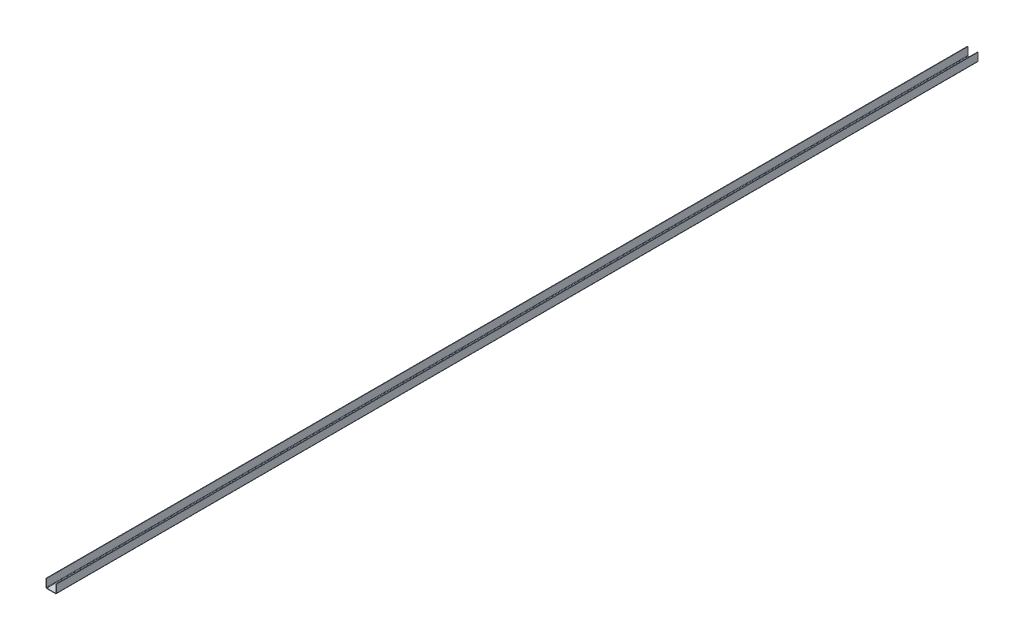
ISO-10303-21;
HEADER;
FILE_DESCRIPTION(('STEP AP214'),'2;1');
FILE_NAME('part.step','',(''),(''),'','','');
FILE_SCHEMA(('AUTOMOTIVE_DESIGN { 1 0 10303 214 1 1 1 1 }'));
ENDSEC;
DATA;
#1=APPLICATION_CONTEXT('core data for automotive mechanical design processes');
#2=APPLICATION_PROTOCOL_DEFINITION('international standard','automotive_design',2000,#1);
#3=PRODUCT_CONTEXT('',#1,'mechanical');
#4=PRODUCT('Part','Part','',(#3));
#5=PRODUCT_RELATED_PRODUCT_CATEGORY('part','',(#4));
#6=PRODUCT_DEFINITION_FORMATION('','',#4);
#7=PRODUCT_DEFINITION_CONTEXT('part definition',#1,'design');
#8=PRODUCT_DEFINITION('design','',#6,#7);
#9=PRODUCT_DEFINITION_SHAPE('','',#8);
#10=(LENGTH_UNIT() NAMED_UNIT(*) SI_UNIT(.MILLI.,.METRE.));
#11=(NAMED_UNIT(*) PLANE_ANGLE_UNIT() SI_UNIT($,.RADIAN.));
#12=(NAMED_UNIT(*) SI_UNIT($,.STERADIAN.) SOLID_ANGLE_UNIT());
#13=UNCERTAINTY_MEASURE_WITH_UNIT(LENGTH_MEASURE(1.E-05),#10,'distance_accuracy_value','');
#14=(GEOMETRIC_REPRESENTATION_CONTEXT(3) GLOBAL_UNCERTAINTY_ASSIGNED_CONTEXT((#13)) GLOBAL_UNIT_ASSIGNED_CONTEXT((#10,
#11,#12)) REPRESENTATION_CONTEXT('',''));
#15=CARTESIAN_POINT('',(0.,0.,0.));
#16=DIRECTION('',(0.,0.,1.));
#17=DIRECTION('',(1.,0.,0.));
#18=AXIS2_PLACEMENT_3D('',#15,#16,#17);
#19=CARTESIAN_POINT('',(-5.73267326732672,-9.84158415841584,498.5));
#20=DIRECTION('',(0.,1.,0.));
#21=DIRECTION('',(-1.,0.,0.));
#22=AXIS2_PLACEMENT_3D('',#19,#20,#21);
#23=CYLINDRICAL_SURFACE('',#22,3.25000000000003);
#24=CARTESIAN_POINT('',(-5.73267326732672,-9.84158415841584,498.5));
#25=DIRECTION('',(0.,1.,0.));
#26=DIRECTION('',(-1.,0.,0.));
#27=AXIS2_PLACEMENT_3D('',#24,#25,#26);
#28=CIRCLE('',#27,3.25000000000003);
#29=CARTESIAN_POINT('',(-8.98267326732676,-9.84158415841584,498.5));
#30=VERTEX_POINT('',#29);
#31=EDGE_CURVE('E42',#30,#30,#28,.T.);
#32=ORIENTED_EDGE('',*,*,#31,.F.);
#33=EDGE_LOOP('',(#32));
#34=FACE_BOUND('',#33,.T.);
#35=CARTESIAN_POINT('',(-5.73267326732672,-8.34158415841584,498.5));
#36=DIRECTION('',(0.,1.,0.));
#37=DIRECTION('',(-1.,0.,0.));
#38=AXIS2_PLACEMENT_3D('',#35,#36,#37);
#39=CIRCLE('',#38,3.25000000000003);
#40=CARTESIAN_POINT('',(-8.98267326732676,-8.34158415841584,498.5));
#41=VERTEX_POINT('',#40);
#42=EDGE_CURVE('E11',#41,#41,#39,.T.);
#43=ORIENTED_EDGE('',*,*,#42,.T.);
#44=EDGE_LOOP('',(#43));
#45=FACE_BOUND('',#44,.T.);
#46=ADVANCED_FACE('F34',(#34,#45),#23,.F.);
#47=CARTESIAN_POINT('',(-21.2326732673267,-6.84158415841582,2997.));
#48=DIRECTION('',(-1.,0.,0.));
#49=DIRECTION('',(0.,0.,1.));
#50=AXIS2_PLACEMENT_3D('',#47,#48,#49);
#51=PLANE('',#50);
#52=DIRECTION('',(0.,1.,0.));
#53=VECTOR('',#52,1.);
#54=CARTESIAN_POINT('',(-21.2326732673267,-6.84158415841582,0.));
#55=LINE('',#54,#53);
#56=CARTESIAN_POINT('',(-21.2326732673267,-6.84158415841584,0.));
#57=VERTEX_POINT('',#56);
#58=CARTESIAN_POINT('',(-21.2326732673267,18.1584158415842,0.));
#59=VERTEX_POINT('',#58);
#60=EDGE_CURVE('E156',#57,#59,#55,.T.);
#61=ORIENTED_EDGE('',*,*,#60,.T.);
#62=DIRECTION('',(0.,0.,-1.));
#63=VECTOR('',#62,1.);
#64=CARTESIAN_POINT('',(-21.2326732673267,18.1584158415842,2997.));
#65=LINE('',#64,#63);
#66=CARTESIAN_POINT('',(-21.2326732673267,18.1584158415842,2997.));
#67=VERTEX_POINT('',#66);
#68=EDGE_CURVE('E203',#67,#59,#65,.T.);
#69=ORIENTED_EDGE('',*,*,#68,.F.);
#70=DIRECTION('',(0.,1.,0.));
#71=VECTOR('',#70,1.);
#72=CARTESIAN_POINT('',(-21.2326732673267,-6.84158415841582,2997.));
#73=LINE('',#72,#71);
#74=CARTESIAN_POINT('',(-21.2326732673267,-6.84158415841584,2997.));
#75=VERTEX_POINT('',#74);
#76=EDGE_CURVE('E103',#75,#67,#73,.T.);
#77=ORIENTED_EDGE('',*,*,#76,.F.);
#78=DIRECTION('',(0.,0.,-1.));
#79=VECTOR('',#78,1.);
#80=CARTESIAN_POINT('',(-21.2326732673267,-6.84158415841584,2997.));
#81=LINE('',#80,#79);
#82=EDGE_CURVE('E152',#75,#57,#81,.T.);
#83=ORIENTED_EDGE('',*,*,#82,.T.);
#84=EDGE_LOOP('',(#61,#69,#77,#83));
#85=FACE_BOUND('',#84,.T.);
#86=ADVANCED_FACE('F211',(#85),#51,.F.);
#87=CARTESIAN_POINT('',(-22.7326732673267,18.1584158415842,2997.));
#88=DIRECTION('',(0.,1.,0.));
#89=DIRECTION('',(0.,0.,1.));
#90=AXIS2_PLACEMENT_3D('',#87,#88,#89);
#91=PLANE('',#90);
#92=DIRECTION('',(1.,0.,0.));
#93=VECTOR('',#92,1.);
#94=CARTESIAN_POINT('',(-22.7326732673267,18.1584158415842,0.));
#95=LINE('',#94,#93);
#96=CARTESIAN_POINT('',(-22.7326732673267,18.1584158415842,0.));
#97=VERTEX_POINT('',#96);
#98=EDGE_CURVE('E159',#97,#59,#95,.T.);
#99=ORIENTED_EDGE('',*,*,#98,.F.);
#100=DIRECTION('',(0.,0.,-1.));
#101=VECTOR('',#100,1.);
#102=CARTESIAN_POINT('',(-22.7326732673267,18.1584158415842,2997.));
#103=LINE('',#102,#101);
#104=CARTESIAN_POINT('',(-22.7326732673267,18.1584158415842,2997.));
#105=VERTEX_POINT('',#104);
#106=EDGE_CURVE('E201',#105,#97,#103,.T.);
#107=ORIENTED_EDGE('',*,*,#106,.F.);
#108=DIRECTION('',(1.,0.,0.));
#109=VECTOR('',#108,1.);
#110=CARTESIAN_POINT('',(-22.7326732673267,18.1584158415842,2997.));
#111=LINE('',#110,#109);
#112=EDGE_CURVE('E267',#105,#67,#111,.T.);
#113=ORIENTED_EDGE('',*,*,#112,.T.);
#114=ORIENTED_EDGE('',*,*,#68,.T.);
#115=EDGE_LOOP('',(#99,#107,#113,#114));
#116=FACE_BOUND('',#115,.T.);
#117=ADVANCED_FACE('F253',(#116),#91,.T.);
#118=CARTESIAN_POINT('',(-22.7326732673267,-6.84158415841582,2997.));
#119=DIRECTION('',(-1.,0.,0.));
#120=DIRECTION('',(0.,0.,1.));
#121=AXIS2_PLACEMENT_3D('',#118,#119,#120);
#122=PLANE('',#121);
#123=DIRECTION('',(0.,1.,0.));
#124=VECTOR('',#123,1.);
#125=CARTESIAN_POINT('',(-22.7326732673267,-6.84158415841582,0.));
#126=LINE('',#125,#124);
#127=CARTESIAN_POINT('',(-22.7326732673267,-6.84158415841584,0.));
#128=VERTEX_POINT('',#127);
#129=EDGE_CURVE('E163',#128,#97,#126,.T.);
#130=ORIENTED_EDGE('',*,*,#129,.F.);
#131=DIRECTION('',(0.,0.,-1.));
#132=VECTOR('',#131,1.);
#133=CARTESIAN_POINT('',(-22.7326732673267,-6.84158415841584,2997.));
#134=LINE('',#133,#132);
#135=CARTESIAN_POINT('',(-22.7326732673267,-6.84158415841584,2997.));
#136=VERTEX_POINT('',#135);
#137=EDGE_CURVE('E199',#136,#128,#134,.T.);
#138=ORIENTED_EDGE('',*,*,#137,.F.);
#139=DIRECTION('',(0.,1.,0.));
#140=VECTOR('',#139,1.);
#141=CARTESIAN_POINT('',(-22.7326732673267,-6.84158415841582,2997.));
#142=LINE('',#141,#140);
#143=EDGE_CURVE('E270',#136,#105,#142,.T.);
#144=ORIENTED_EDGE('',*,*,#143,.T.);
#145=ORIENTED_EDGE('',*,*,#106,.T.);
#146=EDGE_LOOP('',(#130,#138,#144,#145));
#147=FACE_BOUND('',#146,.T.);
#148=ADVANCED_FACE('F249',(#147),#122,.T.);
#149=CARTESIAN_POINT('',(-19.7326732673267,-6.84158415841584,2997.));
#150=DIRECTION('',(0.,0.,-1.));
#151=DIRECTION('',(-1.,0.,0.));
#152=AXIS2_PLACEMENT_3D('',#149,#150,#151);
#153=CYLINDRICAL_SURFACE('',#152,3.);
#154=CARTESIAN_POINT('',(-19.7326732673267,-6.84158415841584,0.));
#155=DIRECTION('',(0.,0.,-1.));
#156=DIRECTION('',(-1.,0.,0.));
#157=AXIS2_PLACEMENT_3D('',#154,#155,#156);
#158=CIRCLE('',#157,3.);
#159=CARTESIAN_POINT('',(-19.7326732673267,-9.84158415841584,0.));
#160=VERTEX_POINT('',#159);
#161=EDGE_CURVE('E166',#160,#128,#158,.T.);
#162=ORIENTED_EDGE('',*,*,#161,.F.);
#163=DIRECTION('',(0.,0.,-1.));
#164=VECTOR('',#163,1.);
#165=CARTESIAN_POINT('',(-19.7326732673267,-9.84158415841584,2997.));
#166=LINE('',#165,#164);
#167=CARTESIAN_POINT('',(-19.7326732673267,-9.84158415841584,2997.));
#168=VERTEX_POINT('',#167);
#169=EDGE_CURVE('E197',#168,#160,#166,.T.);
#170=ORIENTED_EDGE('',*,*,#169,.F.);
#171=CARTESIAN_POINT('',(-19.7326732673267,-6.84158415841584,2997.));
#172=DIRECTION('',(0.,0.,-1.));
#173=DIRECTION('',(-1.,0.,0.));
#174=AXIS2_PLACEMENT_3D('',#171,#172,#173);
#175=CIRCLE('',#174,3.);
#176=EDGE_CURVE('E272',#168,#136,#175,.T.);
#177=ORIENTED_EDGE('',*,*,#176,.T.);
#178=ORIENTED_EDGE('',*,*,#137,.T.);
#179=EDGE_LOOP('',(#162,#170,#177,#178));
#180=FACE_BOUND('',#179,.T.);
#181=ADVANCED_FACE('F245',(#180),#153,.T.);
#182=CARTESIAN_POINT('',(8.26732673267326,-9.84158415841584,2997.));
#183=DIRECTION('',(0.,-1.,0.));
#184=DIRECTION('',(1.,0.,0.));
#185=AXIS2_PLACEMENT_3D('',#182,#183,#184);
#186=PLANE('',#185);
#187=CARTESIAN_POINT('',(-5.73267326732672,-9.84158415841584,1498.5));
#188=DIRECTION('',(0.,1.,0.));
#189=DIRECTION('',(-1.,0.,0.));
#190=AXIS2_PLACEMENT_3D('',#187,#188,#189);
#191=CIRCLE('',#190,3.25000000000003);
#192=CARTESIAN_POINT('',(-8.98267326732676,-9.84158415841584,1498.5));
#193=VERTEX_POINT('',#192);
#194=EDGE_CURVE('E309',#193,#193,#191,.T.);
#195=ORIENTED_EDGE('',*,*,#194,.T.);
#196=EDGE_LOOP('',(#195));
#197=FACE_BOUND('',#196,.T.);
#198=CARTESIAN_POINT('',(-5.73267326732672,-9.84158415841584,2498.5));
#199=DIRECTION('',(0.,1.,0.));
#200=DIRECTION('',(-1.,0.,0.));
#201=AXIS2_PLACEMENT_3D('',#198,#199,#200);
#202=CIRCLE('',#201,3.25000000000003);
#203=CARTESIAN_POINT('',(-8.98267326732676,-9.84158415841584,2498.5));
#204=VERTEX_POINT('',#203);
#205=EDGE_CURVE('E160',#204,#204,#202,.T.);
#206=ORIENTED_EDGE('',*,*,#205,.T.);
#207=EDGE_LOOP('',(#206));
#208=FACE_BOUND('',#207,.T.);
#209=DIRECTION('',(-1.,0.,0.));
#210=VECTOR('',#209,1.);
#211=CARTESIAN_POINT('',(8.26732673267326,-9.84158415841584,0.));
#212=LINE('',#211,#210);
#213=CARTESIAN_POINT('',(8.26732673267326,-9.84158415841584,0.));
#214=VERTEX_POINT('',#213);
#215=EDGE_CURVE('E169',#214,#160,#212,.T.);
#216=ORIENTED_EDGE('',*,*,#215,.F.);
#217=DIRECTION('',(0.,0.,-1.));
#218=VECTOR('',#217,1.);
#219=CARTESIAN_POINT('',(8.26732673267326,-9.84158415841584,2997.));
#220=LINE('',#219,#218);
#221=CARTESIAN_POINT('',(8.26732673267326,-9.84158415841584,2997.));
#222=VERTEX_POINT('',#221);
#223=EDGE_CURVE('E195',#222,#214,#220,.T.);
#224=ORIENTED_EDGE('',*,*,#223,.F.);
#225=DIRECTION('',(-1.,0.,0.));
#226=VECTOR('',#225,1.);
#227=CARTESIAN_POINT('',(8.26732673267326,-9.84158415841584,2997.));
#228=LINE('',#227,#226);
#229=EDGE_CURVE('E279',#222,#168,#228,.T.);
#230=ORIENTED_EDGE('',*,*,#229,.T.);
#231=ORIENTED_EDGE('',*,*,#169,.T.);
#232=EDGE_LOOP('',(#216,#224,#230,#231));
#233=FACE_BOUND('',#232,.T.);
#234=ORIENTED_EDGE('',*,*,#31,.T.);
#235=EDGE_LOOP('',(#234));
#236=FACE_BOUND('',#235,.T.);
#237=ADVANCED_FACE('F207',(#197,#208,#233,#236),#186,.T.);
#238=CARTESIAN_POINT('',(8.26732673267328,-6.84158415841584,2997.));
#239=DIRECTION('',(0.,0.,-1.));
#240=DIRECTION('',(-1.,0.,0.));
#241=AXIS2_PLACEMENT_3D('',#238,#239,#240);
#242=CYLINDRICAL_SURFACE('',#241,3.);
#243=CARTESIAN_POINT('',(8.26732673267328,-6.84158415841584,0.));
#244=DIRECTION('',(0.,0.,-1.));
#245=DIRECTION('',(-1.,0.,0.));
#246=AXIS2_PLACEMENT_3D('',#243,#244,#245);
#247=CIRCLE('',#246,3.);
#248=CARTESIAN_POINT('',(11.2673267326733,-6.84158415841582,0.));
#249=VERTEX_POINT('',#248);
#250=EDGE_CURVE('E172',#249,#214,#247,.T.);
#251=ORIENTED_EDGE('',*,*,#250,.F.);
#252=DIRECTION('',(0.,0.,-1.));
#253=VECTOR('',#252,1.);
#254=CARTESIAN_POINT('',(11.2673267326733,-6.84158415841582,2997.));
#255=LINE('',#254,#253);
#256=CARTESIAN_POINT('',(11.2673267326733,-6.84158415841582,2997.));
#257=VERTEX_POINT('',#256);
#258=EDGE_CURVE('E193',#257,#249,#255,.T.);
#259=ORIENTED_EDGE('',*,*,#258,.F.);
#260=CARTESIAN_POINT('',(8.26732673267328,-6.84158415841584,2997.));
#261=DIRECTION('',(0.,0.,-1.));
#262=DIRECTION('',(-1.,0.,0.));
#263=AXIS2_PLACEMENT_3D('',#260,#261,#262);
#264=CIRCLE('',#263,3.);
#265=EDGE_CURVE('E282',#257,#222,#264,.T.);
#266=ORIENTED_EDGE('',*,*,#265,.T.);
#267=ORIENTED_EDGE('',*,*,#223,.T.);
#268=EDGE_LOOP('',(#251,#259,#266,#267));
#269=FACE_BOUND('',#268,.T.);
#270=ADVANCED_FACE('F238',(#269),#242,.T.);
#271=CARTESIAN_POINT('',(11.2673267326733,18.1584158415842,2997.));
#272=DIRECTION('',(1.,0.,0.));
#273=DIRECTION('',(0.,1.,0.));
#274=AXIS2_PLACEMENT_3D('',#271,#272,#273);
#275=PLANE('',#274);
#276=DIRECTION('',(0.,-1.,0.));
#277=VECTOR('',#276,1.);
#278=CARTESIAN_POINT('',(11.2673267326733,18.1584158415842,0.));
#279=LINE('',#278,#277);
#280=CARTESIAN_POINT('',(11.2673267326733,18.1584158415842,0.));
#281=VERTEX_POINT('',#280);
#282=EDGE_CURVE('E175',#281,#249,#279,.T.);
#283=ORIENTED_EDGE('',*,*,#282,.F.);
#284=DIRECTION('',(0.,0.,-1.));
#285=VECTOR('',#284,1.);
#286=CARTESIAN_POINT('',(11.2673267326733,18.1584158415842,2997.));
#287=LINE('',#286,#285);
#288=CARTESIAN_POINT('',(11.2673267326733,18.1584158415842,2997.));
#289=VERTEX_POINT('',#288);
#290=EDGE_CURVE('E191',#289,#281,#287,.T.);
#291=ORIENTED_EDGE('',*,*,#290,.F.);
#292=DIRECTION('',(0.,-1.,0.));
#293=VECTOR('',#292,1.);
#294=CARTESIAN_POINT('',(11.2673267326733,18.1584158415842,2997.));
#295=LINE('',#294,#293);
#296=EDGE_CURVE('E285',#289,#257,#295,.T.);
#297=ORIENTED_EDGE('',*,*,#296,.T.);
#298=ORIENTED_EDGE('',*,*,#258,.T.);
#299=EDGE_LOOP('',(#283,#291,#297,#298));
#300=FACE_BOUND('',#299,.T.);
#301=ADVANCED_FACE('F234',(#300),#275,.T.);
#302=CARTESIAN_POINT('',(9.76732673267327,18.1584158415842,2997.));
#303=DIRECTION('',(0.,1.,0.));
#304=DIRECTION('',(0.,0.,1.));
#305=AXIS2_PLACEMENT_3D('',#302,#303,#304);
#306=PLANE('',#305);
#307=DIRECTION('',(1.,0.,0.));
#308=VECTOR('',#307,1.);
#309=CARTESIAN_POINT('',(9.76732673267327,18.1584158415842,0.));
#310=LINE('',#309,#308);
#311=CARTESIAN_POINT('',(9.76732673267327,18.1584158415842,0.));
#312=VERTEX_POINT('',#311);
#313=EDGE_CURVE('E178',#312,#281,#310,.T.);
#314=ORIENTED_EDGE('',*,*,#313,.F.);
#315=DIRECTION('',(0.,0.,-1.));
#316=VECTOR('',#315,1.);
#317=CARTESIAN_POINT('',(9.76732673267327,18.1584158415842,2997.));
#318=LINE('',#317,#316);
#319=CARTESIAN_POINT('',(9.76732673267327,18.1584158415842,2997.));
#320=VERTEX_POINT('',#319);
#321=EDGE_CURVE('E189',#320,#312,#318,.T.);
#322=ORIENTED_EDGE('',*,*,#321,.F.);
#323=DIRECTION('',(1.,0.,0.));
#324=VECTOR('',#323,1.);
#325=CARTESIAN_POINT('',(9.76732673267327,18.1584158415842,2997.));
#326=LINE('',#325,#324);
#327=EDGE_CURVE('E288',#320,#289,#326,.T.);
#328=ORIENTED_EDGE('',*,*,#327,.T.);
#329=ORIENTED_EDGE('',*,*,#290,.T.);
#330=EDGE_LOOP('',(#314,#322,#328,#329));
#331=FACE_BOUND('',#330,.T.);
#332=ADVANCED_FACE('F230',(#331),#306,.T.);
#333=CARTESIAN_POINT('',(9.76732673267327,18.1584158415842,2997.));
#334=DIRECTION('',(1.,0.,0.));
#335=DIRECTION('',(0.,1.,0.));
#336=AXIS2_PLACEMENT_3D('',#333,#334,#335);
#337=PLANE('',#336);
#338=DIRECTION('',(0.,-1.,0.));
#339=VECTOR('',#338,1.);
#340=CARTESIAN_POINT('',(9.76732673267327,18.1584158415842,0.));
#341=LINE('',#340,#339);
#342=CARTESIAN_POINT('',(9.76732673267328,-6.84158415841583,0.));
#343=VERTEX_POINT('',#342);
#344=EDGE_CURVE('E181',#312,#343,#341,.T.);
#345=ORIENTED_EDGE('',*,*,#344,.T.);
#346=DIRECTION('',(0.,0.,-1.));
#347=VECTOR('',#346,1.);
#348=CARTESIAN_POINT('',(9.76732673267328,-6.84158415841583,2997.));
#349=LINE('',#348,#347);
#350=CARTESIAN_POINT('',(9.76732673267328,-6.84158415841583,2997.));
#351=VERTEX_POINT('',#350);
#352=EDGE_CURVE('E146',#351,#343,#349,.T.);
#353=ORIENTED_EDGE('',*,*,#352,.F.);
#354=DIRECTION('',(0.,-1.,0.));
#355=VECTOR('',#354,1.);
#356=CARTESIAN_POINT('',(9.76732673267327,18.1584158415842,2997.));
#357=LINE('',#356,#355);
#358=EDGE_CURVE('E137',#320,#351,#357,.T.);
#359=ORIENTED_EDGE('',*,*,#358,.F.);
#360=ORIENTED_EDGE('',*,*,#321,.T.);
#361=EDGE_LOOP('',(#345,#353,#359,#360));
#362=FACE_BOUND('',#361,.T.);
#363=ADVANCED_FACE('F222',(#362),#337,.F.);
#364=CARTESIAN_POINT('',(8.26732673267328,-6.84158415841584,2997.));
#365=DIRECTION('',(0.,0.,-1.));
#366=DIRECTION('',(-1.,0.,0.));
#367=AXIS2_PLACEMENT_3D('',#364,#365,#366);
#368=CYLINDRICAL_SURFACE('',#367,1.5);
#369=CARTESIAN_POINT('',(8.26732673267328,-6.84158415841584,0.));
#370=DIRECTION('',(0.,0.,1.));
#371=DIRECTION('',(1.,0.,0.));
#372=AXIS2_PLACEMENT_3D('',#369,#370,#371);
#373=CIRCLE('',#372,1.5);
#374=CARTESIAN_POINT('',(8.26732673267326,-8.34158415841584,0.));
#375=VERTEX_POINT('',#374);
#376=EDGE_CURVE('E145',#343,#375,#373,.F.);
#377=ORIENTED_EDGE('',*,*,#376,.T.);
#378=DIRECTION('',(0.,0.,-1.));
#379=VECTOR('',#378,1.);
#380=CARTESIAN_POINT('',(8.26732673267326,-8.34158415841584,2997.));
#381=LINE('',#380,#379);
#382=CARTESIAN_POINT('',(8.26732673267326,-8.34158415841584,2997.));
#383=VERTEX_POINT('',#382);
#384=EDGE_CURVE('E142',#383,#375,#381,.T.);
#385=ORIENTED_EDGE('',*,*,#384,.F.);
#386=CARTESIAN_POINT('',(8.26732673267328,-6.84158415841584,2997.));
#387=DIRECTION('',(0.,0.,1.));
#388=DIRECTION('',(1.,0.,0.));
#389=AXIS2_PLACEMENT_3D('',#386,#387,#388);
#390=CIRCLE('',#389,1.5);
#391=EDGE_CURVE('E130',#351,#383,#390,.F.);
#392=ORIENTED_EDGE('',*,*,#391,.F.);
#393=ORIENTED_EDGE('',*,*,#352,.T.);
#394=EDGE_LOOP('',(#377,#385,#392,#393));
#395=FACE_BOUND('',#394,.T.);
#396=ADVANCED_FACE('F143',(#395),#368,.F.);
#397=CARTESIAN_POINT('',(8.26732673267326,-8.34158415841584,2997.));
#398=DIRECTION('',(0.,-1.,0.));
#399=DIRECTION('',(1.,0.,0.));
#400=AXIS2_PLACEMENT_3D('',#397,#398,#399);
#401=PLANE('',#400);
#402=CARTESIAN_POINT('',(-5.73267326732672,-8.34158415841584,1498.5));
#403=DIRECTION('',(0.,1.,0.));
#404=DIRECTION('',(-1.,0.,0.));
#405=AXIS2_PLACEMENT_3D('',#402,#403,#404);
#406=CIRCLE('',#405,3.25000000000003);
#407=CARTESIAN_POINT('',(-8.98267326732676,-8.34158415841584,1498.5));
#408=VERTEX_POINT('',#407);
#409=EDGE_CURVE('E304',#408,#408,#406,.T.);
#410=ORIENTED_EDGE('',*,*,#409,.F.);
#411=EDGE_LOOP('',(#410));
#412=FACE_BOUND('',#411,.T.);
#413=CARTESIAN_POINT('',(-5.73267326732672,-8.34158415841584,2498.5));
#414=DIRECTION('',(0.,1.,0.));
#415=DIRECTION('',(-1.,0.,0.));
#416=AXIS2_PLACEMENT_3D('',#413,#414,#415);
#417=CIRCLE('',#416,3.25000000000003);
#418=CARTESIAN_POINT('',(-8.98267326732676,-8.34158415841584,2498.5));
#419=VERTEX_POINT('',#418);
#420=EDGE_CURVE('E301',#419,#419,#417,.T.);
#421=ORIENTED_EDGE('',*,*,#420,.F.);
#422=EDGE_LOOP('',(#421));
#423=FACE_BOUND('',#422,.T.);
#424=DIRECTION('',(-1.,0.,0.));
#425=VECTOR('',#424,1.);
#426=CARTESIAN_POINT('',(8.26732673267326,-8.34158415841584,0.));
#427=LINE('',#426,#425);
#428=CARTESIAN_POINT('',(-19.7326732673267,-8.34158415841584,0.));
#429=VERTEX_POINT('',#428);
#430=EDGE_CURVE('E91',#375,#429,#427,.T.);
#431=ORIENTED_EDGE('',*,*,#430,.T.);
#432=DIRECTION('',(0.,0.,-1.));
#433=VECTOR('',#432,1.);
#434=CARTESIAN_POINT('',(-19.7326732673267,-8.34158415841584,2997.));
#435=LINE('',#434,#433);
#436=CARTESIAN_POINT('',(-19.7326732673267,-8.34158415841584,2997.));
#437=VERTEX_POINT('',#436);
#438=EDGE_CURVE('E147',#437,#429,#435,.T.);
#439=ORIENTED_EDGE('',*,*,#438,.F.);
#440=DIRECTION('',(-1.,0.,0.));
#441=VECTOR('',#440,1.);
#442=CARTESIAN_POINT('',(8.26732673267326,-8.34158415841584,2997.));
#443=LINE('',#442,#441);
#444=EDGE_CURVE('E134',#383,#437,#443,.T.);
#445=ORIENTED_EDGE('',*,*,#444,.F.);
#446=ORIENTED_EDGE('',*,*,#384,.T.);
#447=EDGE_LOOP('',(#431,#439,#445,#446));
#448=FACE_BOUND('',#447,.T.);
#449=ORIENTED_EDGE('',*,*,#42,.F.);
#450=EDGE_LOOP('',(#449));
#451=FACE_BOUND('',#450,.T.);
#452=ADVANCED_FACE('F149',(#412,#423,#448,#451),#401,.F.);
#453=CARTESIAN_POINT('',(-19.7326732673267,-6.84158415841584,2997.));
#454=DIRECTION('',(0.,0.,-1.));
#455=DIRECTION('',(-1.,0.,0.));
#456=AXIS2_PLACEMENT_3D('',#453,#454,#455);
#457=CYLINDRICAL_SURFACE('',#456,1.5);
#458=CARTESIAN_POINT('',(-19.7326732673267,-6.84158415841584,0.));
#459=DIRECTION('',(0.,0.,1.));
#460=DIRECTION('',(1.,0.,0.));
#461=AXIS2_PLACEMENT_3D('',#458,#459,#460);
#462=CIRCLE('',#461,1.5);
#463=EDGE_CURVE('E97',#429,#57,#462,.F.);
#464=ORIENTED_EDGE('',*,*,#463,.T.);
#465=ORIENTED_EDGE('',*,*,#82,.F.);
#466=CARTESIAN_POINT('',(-19.7326732673267,-6.84158415841584,2997.));
#467=DIRECTION('',(0.,0.,1.));
#468=DIRECTION('',(1.,0.,0.));
#469=AXIS2_PLACEMENT_3D('',#466,#467,#468);
#470=CIRCLE('',#469,1.5);
#471=EDGE_CURVE('E50',#437,#75,#470,.F.);
#472=ORIENTED_EDGE('',*,*,#471,.F.);
#473=ORIENTED_EDGE('',*,*,#438,.T.);
#474=EDGE_LOOP('',(#464,#465,#472,#473));
#475=FACE_BOUND('',#474,.T.);
#476=ADVANCED_FACE('F214',(#475),#457,.F.);
#477=CARTESIAN_POINT('',(-19.7326732673267,-6.84158415841584,2997.));
#478=DIRECTION('',(0.,0.,-1.));
#479=DIRECTION('',(-1.,0.,0.));
#480=AXIS2_PLACEMENT_3D('',#477,#478,#479);
#481=PLANE('',#480);
#482=ORIENTED_EDGE('',*,*,#76,.T.);
#483=ORIENTED_EDGE('',*,*,#112,.F.);
#484=ORIENTED_EDGE('',*,*,#143,.F.);
#485=ORIENTED_EDGE('',*,*,#176,.F.);
#486=ORIENTED_EDGE('',*,*,#229,.F.);
#487=ORIENTED_EDGE('',*,*,#265,.F.);
#488=ORIENTED_EDGE('',*,*,#296,.F.);
#489=ORIENTED_EDGE('',*,*,#327,.F.);
#490=ORIENTED_EDGE('',*,*,#358,.T.);
#491=ORIENTED_EDGE('',*,*,#391,.T.);
#492=ORIENTED_EDGE('',*,*,#444,.T.);
#493=ORIENTED_EDGE('',*,*,#471,.T.);
#494=EDGE_LOOP('',(#482,#483,#484,#485,#486,#487,#488,#489,#490,#491,#492,#493));
#495=FACE_BOUND('',#494,.T.);
#496=ADVANCED_FACE('F132',(#495),#481,.F.);
#497=CARTESIAN_POINT('',(-19.7326732673267,-6.84158415841584,0.));
#498=DIRECTION('',(0.,0.,-1.));
#499=DIRECTION('',(-1.,0.,0.));
#500=AXIS2_PLACEMENT_3D('',#497,#498,#499);
#501=PLANE('',#500);
#502=ORIENTED_EDGE('',*,*,#60,.F.);
#503=ORIENTED_EDGE('',*,*,#463,.F.);
#504=ORIENTED_EDGE('',*,*,#430,.F.);
#505=ORIENTED_EDGE('',*,*,#376,.F.);
#506=ORIENTED_EDGE('',*,*,#344,.F.);
#507=ORIENTED_EDGE('',*,*,#313,.T.);
#508=ORIENTED_EDGE('',*,*,#282,.T.);
#509=ORIENTED_EDGE('',*,*,#250,.T.);
#510=ORIENTED_EDGE('',*,*,#215,.T.);
#511=ORIENTED_EDGE('',*,*,#161,.T.);
#512=ORIENTED_EDGE('',*,*,#129,.T.);
#513=ORIENTED_EDGE('',*,*,#98,.T.);
#514=EDGE_LOOP('',(#502,#503,#504,#505,#506,#507,#508,#509,#510,#511,#512,#513));
#515=FACE_BOUND('',#514,.T.);
#516=ADVANCED_FACE('F265',(#515),#501,.T.);
#517=CARTESIAN_POINT('',(-5.73267326732672,-9.84158415841584,2498.5));
#518=DIRECTION('',(0.,1.,0.));
#519=DIRECTION('',(-1.,0.,0.));
#520=AXIS2_PLACEMENT_3D('',#517,#518,#519);
#521=CYLINDRICAL_SURFACE('',#520,3.25000000000003);
#522=ORIENTED_EDGE('',*,*,#205,.F.);
#523=EDGE_LOOP('',(#522));
#524=FACE_BOUND('',#523,.T.);
#525=ORIENTED_EDGE('',*,*,#420,.T.);
#526=EDGE_LOOP('',(#525));
#527=FACE_BOUND('',#526,.T.);
#528=ADVANCED_FACE('F317',(#524,#527),#521,.F.);
#529=CARTESIAN_POINT('',(-5.73267326732672,-9.84158415841584,1498.5));
#530=DIRECTION('',(0.,1.,0.));
#531=DIRECTION('',(-1.,0.,0.));
#532=AXIS2_PLACEMENT_3D('',#529,#530,#531);
#533=CYLINDRICAL_SURFACE('',#532,3.25000000000003);
#534=ORIENTED_EDGE('',*,*,#194,.F.);
#535=EDGE_LOOP('',(#534));
#536=FACE_BOUND('',#535,.T.);
#537=ORIENTED_EDGE('',*,*,#409,.T.);
#538=EDGE_LOOP('',(#537));
#539=FACE_BOUND('',#538,.T.);
#540=ADVANCED_FACE('F314',(#536,#539),#533,.F.);
#541=CLOSED_SHELL('',(#46,#86,#117,#148,#181,#237,#270,#301,#332,#363,#396,#452,#476,#496,#516,
#528,#540));
#542=MANIFOLD_SOLID_BREP('B2',#541);
#543=ADVANCED_BREP_SHAPE_REPRESENTATION('',(#18,#542),#14);
#544=SHAPE_DEFINITION_REPRESENTATION(#9,#543);
ENDSEC;
END-ISO-10303-21;
